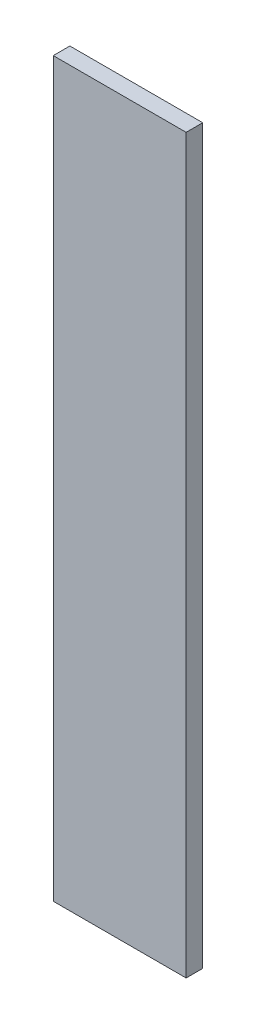
ISO-10303-21;
HEADER;
FILE_DESCRIPTION(('STEP AP214'),'2;1');
FILE_NAME('part.step','',(''),(''),'','','');
FILE_SCHEMA(('AUTOMOTIVE_DESIGN { 1 0 10303 214 1 1 1 1 }'));
ENDSEC;
DATA;
#1=APPLICATION_CONTEXT('core data for automotive mechanical design processes');
#2=APPLICATION_PROTOCOL_DEFINITION('international standard','automotive_design',2000,#1);
#3=PRODUCT_CONTEXT('',#1,'mechanical');
#4=PRODUCT('Part','Part','',(#3));
#5=PRODUCT_RELATED_PRODUCT_CATEGORY('part','',(#4));
#6=PRODUCT_DEFINITION_FORMATION('','',#4);
#7=PRODUCT_DEFINITION_CONTEXT('part definition',#1,'design');
#8=PRODUCT_DEFINITION('design','',#6,#7);
#9=PRODUCT_DEFINITION_SHAPE('','',#8);
#10=(LENGTH_UNIT() NAMED_UNIT(*) SI_UNIT(.MILLI.,.METRE.));
#11=(NAMED_UNIT(*) PLANE_ANGLE_UNIT() SI_UNIT($,.RADIAN.));
#12=(NAMED_UNIT(*) SI_UNIT($,.STERADIAN.) SOLID_ANGLE_UNIT());
#13=UNCERTAINTY_MEASURE_WITH_UNIT(LENGTH_MEASURE(1.E-05),#10,'distance_accuracy_value','');
#14=(GEOMETRIC_REPRESENTATION_CONTEXT(3) GLOBAL_UNCERTAINTY_ASSIGNED_CONTEXT((#13)) GLOBAL_UNIT_ASSIGNED_CONTEXT((#10,
#11,#12)) REPRESENTATION_CONTEXT('',''));
#15=CARTESIAN_POINT('',(0.,0.,0.));
#16=DIRECTION('',(0.,0.,1.));
#17=DIRECTION('',(1.,0.,0.));
#18=AXIS2_PLACEMENT_3D('',#15,#16,#17);
#19=CARTESIAN_POINT('',(0.,0.,3.175));
#20=DIRECTION('',(1.,0.,0.));
#21=DIRECTION('',(0.,0.,-1.));
#22=AXIS2_PLACEMENT_3D('',#19,#20,#21);
#23=PLANE('',#22);
#24=DIRECTION('',(0.,-1.,0.));
#25=VECTOR('',#24,1.);
#26=CARTESIAN_POINT('',(0.,0.,0.));
#27=LINE('',#26,#25);
#28=CARTESIAN_POINT('',(0.,140.,0.));
#29=VERTEX_POINT('',#28);
#30=CARTESIAN_POINT('',(0.,0.,0.));
#31=VERTEX_POINT('',#30);
#32=EDGE_CURVE('E111',#29,#31,#27,.T.);
#33=ORIENTED_EDGE('',*,*,#32,.T.);
#34=DIRECTION('',(0.,0.,-1.));
#35=VECTOR('',#34,1.);
#36=CARTESIAN_POINT('',(0.,0.,3.175));
#37=LINE('',#36,#35);
#38=CARTESIAN_POINT('',(0.,0.,3.175));
#39=VERTEX_POINT('',#38);
#40=EDGE_CURVE('E11',#39,#31,#37,.T.);
#41=ORIENTED_EDGE('',*,*,#40,.F.);
#42=DIRECTION('',(0.,-1.,0.));
#43=VECTOR('',#42,1.);
#44=CARTESIAN_POINT('',(0.,0.,3.175));
#45=LINE('',#44,#43);
#46=CARTESIAN_POINT('',(0.,140.,3.175));
#47=VERTEX_POINT('',#46);
#48=EDGE_CURVE('E95',#47,#39,#45,.T.);
#49=ORIENTED_EDGE('',*,*,#48,.F.);
#50=DIRECTION('',(0.,0.,-1.));
#51=VECTOR('',#50,1.);
#52=CARTESIAN_POINT('',(0.,140.,3.175));
#53=LINE('',#52,#51);
#54=EDGE_CURVE('E107',#47,#29,#53,.T.);
#55=ORIENTED_EDGE('',*,*,#54,.T.);
#56=EDGE_LOOP('',(#33,#41,#49,#55));
#57=FACE_BOUND('',#56,.T.);
#58=ADVANCED_FACE('F43',(#57),#23,.F.);
#59=CARTESIAN_POINT('',(0.,0.,3.175));
#60=DIRECTION('',(0.,1.,0.));
#61=DIRECTION('',(0.,0.,1.));
#62=AXIS2_PLACEMENT_3D('',#59,#60,#61);
#63=PLANE('',#62);
#64=DIRECTION('',(1.,0.,0.));
#65=VECTOR('',#64,1.);
#66=CARTESIAN_POINT('',(0.,0.,0.));
#67=LINE('',#66,#65);
#68=CARTESIAN_POINT('',(25.4,0.,0.));
#69=VERTEX_POINT('',#68);
#70=EDGE_CURVE('E100',#31,#69,#67,.T.);
#71=ORIENTED_EDGE('',*,*,#70,.T.);
#72=DIRECTION('',(0.,0.,-1.));
#73=VECTOR('',#72,1.);
#74=CARTESIAN_POINT('',(25.4,0.,3.175));
#75=LINE('',#74,#73);
#76=CARTESIAN_POINT('',(25.4,0.,3.175));
#77=VERTEX_POINT('',#76);
#78=EDGE_CURVE('E52',#77,#69,#75,.T.);
#79=ORIENTED_EDGE('',*,*,#78,.F.);
#80=DIRECTION('',(1.,0.,0.));
#81=VECTOR('',#80,1.);
#82=CARTESIAN_POINT('',(0.,0.,3.175));
#83=LINE('',#82,#81);
#84=EDGE_CURVE('E90',#39,#77,#83,.T.);
#85=ORIENTED_EDGE('',*,*,#84,.F.);
#86=ORIENTED_EDGE('',*,*,#40,.T.);
#87=EDGE_LOOP('',(#71,#79,#85,#86));
#88=FACE_BOUND('',#87,.T.);
#89=ADVANCED_FACE('F99',(#88),#63,.F.);
#90=CARTESIAN_POINT('',(25.4,0.,3.175));
#91=DIRECTION('',(-1.,0.,0.));
#92=DIRECTION('',(0.,0.,1.));
#93=AXIS2_PLACEMENT_3D('',#90,#91,#92);
#94=PLANE('',#93);
#95=DIRECTION('',(0.,1.,0.));
#96=VECTOR('',#95,1.);
#97=CARTESIAN_POINT('',(25.4,0.,0.));
#98=LINE('',#97,#96);
#99=CARTESIAN_POINT('',(25.4,140.,0.));
#100=VERTEX_POINT('',#99);
#101=EDGE_CURVE('E77',#69,#100,#98,.T.);
#102=ORIENTED_EDGE('',*,*,#101,.T.);
#103=DIRECTION('',(0.,0.,-1.));
#104=VECTOR('',#103,1.);
#105=CARTESIAN_POINT('',(25.4,140.,3.175));
#106=LINE('',#105,#104);
#107=CARTESIAN_POINT('',(25.4,140.,3.175));
#108=VERTEX_POINT('',#107);
#109=EDGE_CURVE('E102',#108,#100,#106,.T.);
#110=ORIENTED_EDGE('',*,*,#109,.F.);
#111=DIRECTION('',(0.,1.,0.));
#112=VECTOR('',#111,1.);
#113=CARTESIAN_POINT('',(25.4,0.,3.175));
#114=LINE('',#113,#112);
#115=EDGE_CURVE('E93',#77,#108,#114,.T.);
#116=ORIENTED_EDGE('',*,*,#115,.F.);
#117=ORIENTED_EDGE('',*,*,#78,.T.);
#118=EDGE_LOOP('',(#102,#110,#116,#117));
#119=FACE_BOUND('',#118,.T.);
#120=ADVANCED_FACE('F103',(#119),#94,.F.);
#121=CARTESIAN_POINT('',(0.,140.,3.175));
#122=DIRECTION('',(0.,-1.,0.));
#123=DIRECTION('',(0.,0.,-1.));
#124=AXIS2_PLACEMENT_3D('',#121,#122,#123);
#125=PLANE('',#124);
#126=DIRECTION('',(-1.,0.,0.));
#127=VECTOR('',#126,1.);
#128=CARTESIAN_POINT('',(0.,140.,0.));
#129=LINE('',#128,#127);
#130=EDGE_CURVE('E83',#100,#29,#129,.T.);
#131=ORIENTED_EDGE('',*,*,#130,.T.);
#132=ORIENTED_EDGE('',*,*,#54,.F.);
#133=DIRECTION('',(-1.,0.,0.));
#134=VECTOR('',#133,1.);
#135=CARTESIAN_POINT('',(0.,140.,3.175));
#136=LINE('',#135,#134);
#137=EDGE_CURVE('E60',#108,#47,#136,.T.);
#138=ORIENTED_EDGE('',*,*,#137,.F.);
#139=ORIENTED_EDGE('',*,*,#109,.T.);
#140=EDGE_LOOP('',(#131,#132,#138,#139));
#141=FACE_BOUND('',#140,.T.);
#142=ADVANCED_FACE('F124',(#141),#125,.F.);
#143=CARTESIAN_POINT('',(0.,0.,3.175));
#144=DIRECTION('',(0.,0.,-1.));
#145=DIRECTION('',(-1.,0.,0.));
#146=AXIS2_PLACEMENT_3D('',#143,#144,#145);
#147=PLANE('',#146);
#148=ORIENTED_EDGE('',*,*,#48,.T.);
#149=ORIENTED_EDGE('',*,*,#84,.T.);
#150=ORIENTED_EDGE('',*,*,#115,.T.);
#151=ORIENTED_EDGE('',*,*,#137,.T.);
#152=EDGE_LOOP('',(#148,#149,#150,#151));
#153=FACE_BOUND('',#152,.T.);
#154=ADVANCED_FACE('F91',(#153),#147,.F.);
#155=CARTESIAN_POINT('',(0.,0.,0.));
#156=DIRECTION('',(0.,0.,-1.));
#157=DIRECTION('',(-1.,0.,0.));
#158=AXIS2_PLACEMENT_3D('',#155,#156,#157);
#159=PLANE('',#158);
#160=ORIENTED_EDGE('',*,*,#32,.F.);
#161=ORIENTED_EDGE('',*,*,#130,.F.);
#162=ORIENTED_EDGE('',*,*,#101,.F.);
#163=ORIENTED_EDGE('',*,*,#70,.F.);
#164=EDGE_LOOP('',(#160,#161,#162,#163));
#165=FACE_BOUND('',#164,.T.);
#166=ADVANCED_FACE('F127',(#165),#159,.T.);
#167=CLOSED_SHELL('',(#58,#89,#120,#142,#154,#166));
#168=MANIFOLD_SOLID_BREP('B2',#167);
#169=ADVANCED_BREP_SHAPE_REPRESENTATION('',(#18,#168),#14);
#170=SHAPE_DEFINITION_REPRESENTATION(#9,#169);
ENDSEC;
END-ISO-10303-21;
